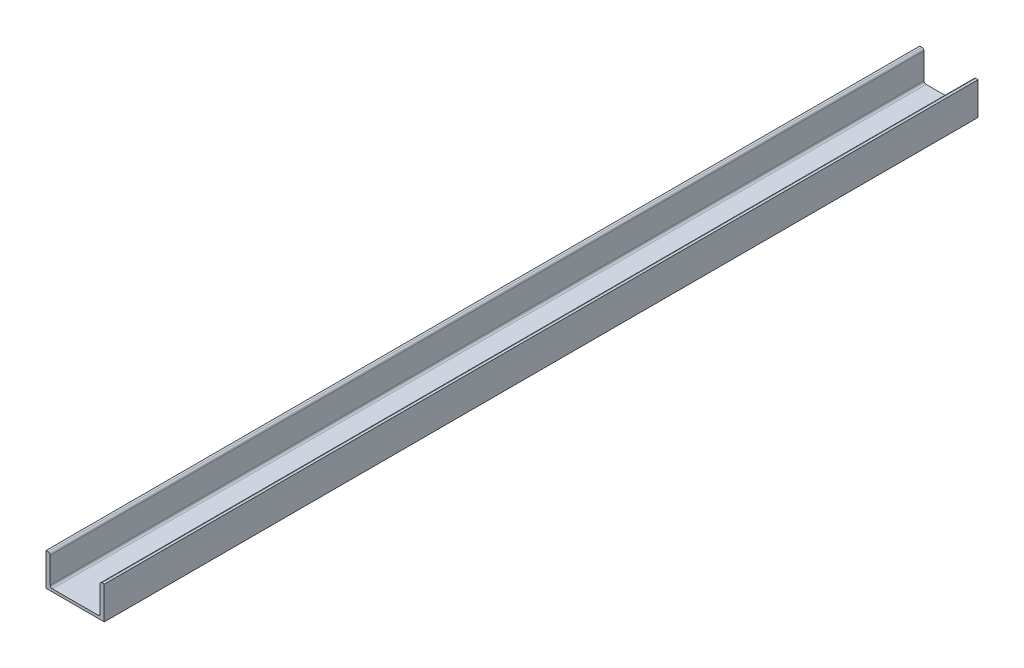
ISO-10303-21;
HEADER;
FILE_DESCRIPTION(('STEP AP214'),'2;1');
FILE_NAME('part.step','',(''),(''),'','','');
FILE_SCHEMA(('AUTOMOTIVE_DESIGN { 1 0 10303 214 1 1 1 1 }'));
ENDSEC;
DATA;
#1=APPLICATION_CONTEXT('core data for automotive mechanical design processes');
#2=APPLICATION_PROTOCOL_DEFINITION('international standard','automotive_design',2000,#1);
#3=PRODUCT_CONTEXT('',#1,'mechanical');
#4=PRODUCT('Part','Part','',(#3));
#5=PRODUCT_RELATED_PRODUCT_CATEGORY('part','',(#4));
#6=PRODUCT_DEFINITION_FORMATION('','',#4);
#7=PRODUCT_DEFINITION_CONTEXT('part definition',#1,'design');
#8=PRODUCT_DEFINITION('design','',#6,#7);
#9=PRODUCT_DEFINITION_SHAPE('','',#8);
#10=(LENGTH_UNIT() NAMED_UNIT(*) SI_UNIT(.MILLI.,.METRE.));
#11=(NAMED_UNIT(*) PLANE_ANGLE_UNIT() SI_UNIT($,.RADIAN.));
#12=(NAMED_UNIT(*) SI_UNIT($,.STERADIAN.) SOLID_ANGLE_UNIT());
#13=UNCERTAINTY_MEASURE_WITH_UNIT(LENGTH_MEASURE(1.E-05),#10,'distance_accuracy_value','');
#14=(GEOMETRIC_REPRESENTATION_CONTEXT(3) GLOBAL_UNCERTAINTY_ASSIGNED_CONTEXT((#13)) GLOBAL_UNIT_ASSIGNED_CONTEXT((#10,
#11,#12)) REPRESENTATION_CONTEXT('',''));
#15=CARTESIAN_POINT('',(0.,0.,0.));
#16=DIRECTION('',(0.,0.,1.));
#17=DIRECTION('',(1.,0.,0.));
#18=AXIS2_PLACEMENT_3D('',#15,#16,#17);
#19=CARTESIAN_POINT('',(-43.434,28.575,762.));
#20=DIRECTION('',(0.,-1.,0.));
#21=DIRECTION('',(0.,0.,-1.));
#22=AXIS2_PLACEMENT_3D('',#19,#20,#21);
#23=PLANE('',#22);
#24=DIRECTION('',(-1.,0.,0.));
#25=VECTOR('',#24,1.);
#26=CARTESIAN_POINT('',(-43.434,28.575,762.));
#27=LINE('',#26,#25);
#28=CARTESIAN_POINT('',(-47.117,28.575,762.));
#29=VERTEX_POINT('',#28);
#30=CARTESIAN_POINT('',(-50.8,28.575,762.));
#31=VERTEX_POINT('',#30);
#32=EDGE_CURVE('E120',#29,#31,#27,.T.);
#33=ORIENTED_EDGE('',*,*,#32,.F.);
#34=DIRECTION('',(0.,0.,-1.));
#35=VECTOR('',#34,1.);
#36=CARTESIAN_POINT('',(-47.117,28.575,762.));
#37=LINE('',#36,#35);
#38=CARTESIAN_POINT('',(-47.117,28.575,-762.));
#39=VERTEX_POINT('',#38);
#40=EDGE_CURVE('E146',#29,#39,#37,.T.);
#41=ORIENTED_EDGE('',*,*,#40,.T.);
#42=DIRECTION('',(-1.,0.,0.));
#43=VECTOR('',#42,1.);
#44=CARTESIAN_POINT('',(-43.434,28.575,-762.));
#45=LINE('',#44,#43);
#46=CARTESIAN_POINT('',(-50.8,28.575,-762.));
#47=VERTEX_POINT('',#46);
#48=EDGE_CURVE('E144',#39,#47,#45,.T.);
#49=ORIENTED_EDGE('',*,*,#48,.T.);
#50=DIRECTION('',(0.,0.,-1.));
#51=VECTOR('',#50,1.);
#52=CARTESIAN_POINT('',(-50.8,28.575,762.));
#53=LINE('',#52,#51);
#54=EDGE_CURVE('E137',#31,#47,#53,.T.);
#55=ORIENTED_EDGE('',*,*,#54,.F.);
#56=EDGE_LOOP('',(#33,#41,#49,#55));
#57=FACE_BOUND('',#56,.T.);
#58=ADVANCED_FACE('F32',(#57),#23,.F.);
#59=CARTESIAN_POINT('',(-50.8,28.575,762.));
#60=DIRECTION('',(1.,0.,0.));
#61=DIRECTION('',(0.,0.,-1.));
#62=AXIS2_PLACEMENT_3D('',#59,#60,#61);
#63=PLANE('',#62);
#64=DIRECTION('',(0.,-1.,0.));
#65=VECTOR('',#64,1.);
#66=CARTESIAN_POINT('',(-50.8,28.575,-762.));
#67=LINE('',#66,#65);
#68=CARTESIAN_POINT('',(-50.8,-28.575,-762.));
#69=VERTEX_POINT('',#68);
#70=EDGE_CURVE('E206',#47,#69,#67,.T.);
#71=ORIENTED_EDGE('',*,*,#70,.T.);
#72=DIRECTION('',(0.,0.,-1.));
#73=VECTOR('',#72,1.);
#74=CARTESIAN_POINT('',(-50.8,-28.575,762.));
#75=LINE('',#74,#73);
#76=CARTESIAN_POINT('',(-50.8,-28.575,762.));
#77=VERTEX_POINT('',#76);
#78=EDGE_CURVE('E139',#77,#69,#75,.T.);
#79=ORIENTED_EDGE('',*,*,#78,.F.);
#80=DIRECTION('',(0.,-1.,0.));
#81=VECTOR('',#80,1.);
#82=CARTESIAN_POINT('',(-50.8,28.575,762.));
#83=LINE('',#82,#81);
#84=EDGE_CURVE('E124',#31,#77,#83,.T.);
#85=ORIENTED_EDGE('',*,*,#84,.F.);
#86=ORIENTED_EDGE('',*,*,#54,.T.);
#87=EDGE_LOOP('',(#71,#79,#85,#86));
#88=FACE_BOUND('',#87,.T.);
#89=ADVANCED_FACE('F136',(#88),#63,.F.);
#90=CARTESIAN_POINT('',(-50.8,-28.575,762.));
#91=DIRECTION('',(0.,1.,0.));
#92=DIRECTION('',(-1.,0.,0.));
#93=AXIS2_PLACEMENT_3D('',#90,#91,#92);
#94=PLANE('',#93);
#95=DIRECTION('',(1.,0.,0.));
#96=VECTOR('',#95,1.);
#97=CARTESIAN_POINT('',(-50.8,-28.575,-762.));
#98=LINE('',#97,#96);
#99=CARTESIAN_POINT('',(50.8,-28.575,-762.));
#100=VERTEX_POINT('',#99);
#101=EDGE_CURVE('E208',#69,#100,#98,.T.);
#102=ORIENTED_EDGE('',*,*,#101,.T.);
#103=DIRECTION('',(0.,0.,-1.));
#104=VECTOR('',#103,1.);
#105=CARTESIAN_POINT('',(50.8,-28.575,762.));
#106=LINE('',#105,#104);
#107=CARTESIAN_POINT('',(50.8,-28.575,762.));
#108=VERTEX_POINT('',#107);
#109=EDGE_CURVE('E150',#108,#100,#106,.T.);
#110=ORIENTED_EDGE('',*,*,#109,.F.);
#111=DIRECTION('',(1.,0.,0.));
#112=VECTOR('',#111,1.);
#113=CARTESIAN_POINT('',(-50.8,-28.575,762.));
#114=LINE('',#113,#112);
#115=EDGE_CURVE('E141',#77,#108,#114,.T.);
#116=ORIENTED_EDGE('',*,*,#115,.F.);
#117=ORIENTED_EDGE('',*,*,#78,.T.);
#118=EDGE_LOOP('',(#102,#110,#116,#117));
#119=FACE_BOUND('',#118,.T.);
#120=ADVANCED_FACE('F246',(#119),#94,.F.);
#121=CARTESIAN_POINT('',(50.8,-28.575,762.));
#122=DIRECTION('',(-1.,0.,0.));
#123=DIRECTION('',(0.,-1.,0.));
#124=AXIS2_PLACEMENT_3D('',#121,#122,#123);
#125=PLANE('',#124);
#126=DIRECTION('',(0.,1.,0.));
#127=VECTOR('',#126,1.);
#128=CARTESIAN_POINT('',(50.8,-28.575,-762.));
#129=LINE('',#128,#127);
#130=CARTESIAN_POINT('',(50.8,28.575,-762.));
#131=VERTEX_POINT('',#130);
#132=EDGE_CURVE('E210',#100,#131,#129,.T.);
#133=ORIENTED_EDGE('',*,*,#132,.T.);
#134=DIRECTION('',(0.,0.,-1.));
#135=VECTOR('',#134,1.);
#136=CARTESIAN_POINT('',(50.8,28.575,762.));
#137=LINE('',#136,#135);
#138=CARTESIAN_POINT('',(50.8,28.575,762.));
#139=VERTEX_POINT('',#138);
#140=EDGE_CURVE('E197',#139,#131,#137,.T.);
#141=ORIENTED_EDGE('',*,*,#140,.F.);
#142=DIRECTION('',(0.,1.,0.));
#143=VECTOR('',#142,1.);
#144=CARTESIAN_POINT('',(50.8,-28.575,762.));
#145=LINE('',#144,#143);
#146=EDGE_CURVE('E224',#108,#139,#145,.T.);
#147=ORIENTED_EDGE('',*,*,#146,.F.);
#148=ORIENTED_EDGE('',*,*,#109,.T.);
#149=EDGE_LOOP('',(#133,#141,#147,#148));
#150=FACE_BOUND('',#149,.T.);
#151=ADVANCED_FACE('F222',(#150),#125,.F.);
#152=CARTESIAN_POINT('',(50.8,28.575,762.));
#153=DIRECTION('',(0.,-1.,0.));
#154=DIRECTION('',(1.,0.,0.));
#155=AXIS2_PLACEMENT_3D('',#152,#153,#154);
#156=PLANE('',#155);
#157=DIRECTION('',(-1.,0.,0.));
#158=VECTOR('',#157,1.);
#159=CARTESIAN_POINT('',(50.8,28.575,-762.));
#160=LINE('',#159,#158);
#161=CARTESIAN_POINT('',(47.117,28.575,-762.));
#162=VERTEX_POINT('',#161);
#163=EDGE_CURVE('E212',#131,#162,#160,.T.);
#164=ORIENTED_EDGE('',*,*,#163,.T.);
#165=DIRECTION('',(0.,0.,-1.));
#166=VECTOR('',#165,1.);
#167=CARTESIAN_POINT('',(47.117,28.575,762.));
#168=LINE('',#167,#166);
#169=CARTESIAN_POINT('',(47.117,28.575,762.));
#170=VERTEX_POINT('',#169);
#171=EDGE_CURVE('E170',#162,#170,#168,.F.);
#172=ORIENTED_EDGE('',*,*,#171,.T.);
#173=DIRECTION('',(-1.,0.,0.));
#174=VECTOR('',#173,1.);
#175=CARTESIAN_POINT('',(50.8,28.575,762.));
#176=LINE('',#175,#174);
#177=EDGE_CURVE('E239',#139,#170,#176,.T.);
#178=ORIENTED_EDGE('',*,*,#177,.F.);
#179=ORIENTED_EDGE('',*,*,#140,.T.);
#180=EDGE_LOOP('',(#164,#172,#178,#179));
#181=FACE_BOUND('',#180,.T.);
#182=ADVANCED_FACE('F231',(#181),#156,.F.);
#183=CARTESIAN_POINT('',(43.434,28.575,762.));
#184=DIRECTION('',(1.,0.,0.));
#185=DIRECTION('',(0.,1.,0.));
#186=AXIS2_PLACEMENT_3D('',#183,#184,#185);
#187=PLANE('',#186);
#188=DIRECTION('',(0.,-1.,0.));
#189=VECTOR('',#188,1.);
#190=CARTESIAN_POINT('',(43.434,28.575,762.));
#191=LINE('',#190,#189);
#192=CARTESIAN_POINT('',(43.434,24.892,762.));
#193=VERTEX_POINT('',#192);
#194=CARTESIAN_POINT('',(43.434,-20.066,762.));
#195=VERTEX_POINT('',#194);
#196=EDGE_CURVE('E201',#193,#195,#191,.T.);
#197=ORIENTED_EDGE('',*,*,#196,.F.);
#198=DIRECTION('',(0.,0.,-1.));
#199=VECTOR('',#198,1.);
#200=CARTESIAN_POINT('',(43.434,24.892,762.));
#201=LINE('',#200,#199);
#202=CARTESIAN_POINT('',(43.434,24.892,-762.));
#203=VERTEX_POINT('',#202);
#204=EDGE_CURVE('E167',#193,#203,#201,.T.);
#205=ORIENTED_EDGE('',*,*,#204,.T.);
#206=DIRECTION('',(0.,-1.,0.));
#207=VECTOR('',#206,1.);
#208=CARTESIAN_POINT('',(43.434,28.575,-762.));
#209=LINE('',#208,#207);
#210=CARTESIAN_POINT('',(43.434,-20.066,-762.));
#211=VERTEX_POINT('',#210);
#212=EDGE_CURVE('E188',#203,#211,#209,.T.);
#213=ORIENTED_EDGE('',*,*,#212,.T.);
#214=DIRECTION('',(0.,0.,-1.));
#215=VECTOR('',#214,1.);
#216=CARTESIAN_POINT('',(43.434,-20.066,762.));
#217=LINE('',#216,#215);
#218=EDGE_CURVE('E165',#211,#195,#217,.F.);
#219=ORIENTED_EDGE('',*,*,#218,.T.);
#220=EDGE_LOOP('',(#197,#205,#213,#219));
#221=FACE_BOUND('',#220,.T.);
#222=ADVANCED_FACE('F241',(#221),#187,.F.);
#223=CARTESIAN_POINT('',(43.434,-23.749,762.));
#224=DIRECTION('',(0.,-1.,0.));
#225=DIRECTION('',(1.,0.,0.));
#226=AXIS2_PLACEMENT_3D('',#223,#224,#225);
#227=PLANE('',#226);
#228=DIRECTION('',(-1.,0.,0.));
#229=VECTOR('',#228,1.);
#230=CARTESIAN_POINT('',(43.434,-23.749,762.));
#231=LINE('',#230,#229);
#232=CARTESIAN_POINT('',(39.751,-23.749,762.));
#233=VERTEX_POINT('',#232);
#234=CARTESIAN_POINT('',(-39.751,-23.749,762.));
#235=VERTEX_POINT('',#234);
#236=EDGE_CURVE('E193',#233,#235,#231,.T.);
#237=ORIENTED_EDGE('',*,*,#236,.F.);
#238=DIRECTION('',(0.,0.,-1.));
#239=VECTOR('',#238,1.);
#240=CARTESIAN_POINT('',(39.751,-23.749,-762.));
#241=LINE('',#240,#239);
#242=CARTESIAN_POINT('',(39.751,-23.749,-762.));
#243=VERTEX_POINT('',#242);
#244=EDGE_CURVE('E173',#233,#243,#241,.T.);
#245=ORIENTED_EDGE('',*,*,#244,.T.);
#246=DIRECTION('',(-1.,0.,0.));
#247=VECTOR('',#246,1.);
#248=CARTESIAN_POINT('',(43.434,-23.749,-762.));
#249=LINE('',#248,#247);
#250=CARTESIAN_POINT('',(-39.751,-23.749,-762.));
#251=VERTEX_POINT('',#250);
#252=EDGE_CURVE('E182',#243,#251,#249,.T.);
#253=ORIENTED_EDGE('',*,*,#252,.T.);
#254=DIRECTION('',(0.,0.,-1.));
#255=VECTOR('',#254,1.);
#256=CARTESIAN_POINT('',(-39.751,-23.749,762.));
#257=LINE('',#256,#255);
#258=EDGE_CURVE('E47',#251,#235,#257,.F.);
#259=ORIENTED_EDGE('',*,*,#258,.T.);
#260=EDGE_LOOP('',(#237,#245,#253,#259));
#261=FACE_BOUND('',#260,.T.);
#262=ADVANCED_FACE('F186',(#261),#227,.F.);
#263=CARTESIAN_POINT('',(-43.434,-23.749,762.));
#264=DIRECTION('',(-1.,0.,0.));
#265=DIRECTION('',(0.,0.,1.));
#266=AXIS2_PLACEMENT_3D('',#263,#264,#265);
#267=PLANE('',#266);
#268=DIRECTION('',(0.,1.,0.));
#269=VECTOR('',#268,1.);
#270=CARTESIAN_POINT('',(-43.434,-23.749,-762.));
#271=LINE('',#270,#269);
#272=CARTESIAN_POINT('',(-43.434,-20.066,-762.));
#273=VERTEX_POINT('',#272);
#274=CARTESIAN_POINT('',(-43.434,24.892,-762.));
#275=VERTEX_POINT('',#274);
#276=EDGE_CURVE('E132',#273,#275,#271,.T.);
#277=ORIENTED_EDGE('',*,*,#276,.T.);
#278=DIRECTION('',(0.,0.,-1.));
#279=VECTOR('',#278,1.);
#280=CARTESIAN_POINT('',(-43.434,24.892,762.));
#281=LINE('',#280,#279);
#282=CARTESIAN_POINT('',(-43.434,24.892,762.));
#283=VERTEX_POINT('',#282);
#284=EDGE_CURVE('E160',#275,#283,#281,.F.);
#285=ORIENTED_EDGE('',*,*,#284,.T.);
#286=DIRECTION('',(0.,1.,0.));
#287=VECTOR('',#286,1.);
#288=CARTESIAN_POINT('',(-43.434,-23.749,762.));
#289=LINE('',#288,#287);
#290=CARTESIAN_POINT('',(-43.434,-20.066,762.));
#291=VERTEX_POINT('',#290);
#292=EDGE_CURVE('E192',#291,#283,#289,.T.);
#293=ORIENTED_EDGE('',*,*,#292,.F.);
#294=DIRECTION('',(0.,0.,-1.));
#295=VECTOR('',#294,1.);
#296=CARTESIAN_POINT('',(-43.434,-20.066,-762.));
#297=LINE('',#296,#295);
#298=EDGE_CURVE('E157',#291,#273,#297,.T.);
#299=ORIENTED_EDGE('',*,*,#298,.T.);
#300=EDGE_LOOP('',(#277,#285,#293,#299));
#301=FACE_BOUND('',#300,.T.);
#302=ADVANCED_FACE('F195',(#301),#267,.F.);
#303=CARTESIAN_POINT('',(0.,0.,762.));
#304=DIRECTION('',(0.,0.,1.));
#305=DIRECTION('',(1.,0.,0.));
#306=AXIS2_PLACEMENT_3D('',#303,#304,#305);
#307=PLANE('',#306);
#308=ORIENTED_EDGE('',*,*,#292,.T.);
#309=CARTESIAN_POINT('',(-47.117,24.892,762.));
#310=DIRECTION('',(0.,0.,1.));
#311=DIRECTION('',(1.,0.,0.));
#312=AXIS2_PLACEMENT_3D('',#309,#310,#311);
#313=CIRCLE('',#312,3.683);
#314=EDGE_CURVE('E127',#283,#29,#313,.T.);
#315=ORIENTED_EDGE('',*,*,#314,.T.);
#316=ORIENTED_EDGE('',*,*,#32,.T.);
#317=ORIENTED_EDGE('',*,*,#84,.T.);
#318=ORIENTED_EDGE('',*,*,#115,.T.);
#319=ORIENTED_EDGE('',*,*,#146,.T.);
#320=ORIENTED_EDGE('',*,*,#177,.T.);
#321=CARTESIAN_POINT('',(47.117,24.892,762.));
#322=DIRECTION('',(0.,0.,1.));
#323=DIRECTION('',(1.,0.,0.));
#324=AXIS2_PLACEMENT_3D('',#321,#322,#323);
#325=CIRCLE('',#324,3.683);
#326=EDGE_CURVE('E162',#170,#193,#325,.T.);
#327=ORIENTED_EDGE('',*,*,#326,.T.);
#328=ORIENTED_EDGE('',*,*,#196,.T.);
#329=CARTESIAN_POINT('',(39.751,-20.066,762.));
#330=DIRECTION('',(0.,0.,1.));
#331=DIRECTION('',(1.,0.,0.));
#332=AXIS2_PLACEMENT_3D('',#329,#330,#331);
#333=CIRCLE('',#332,3.683);
#334=EDGE_CURVE('E54',#195,#233,#333,.F.);
#335=ORIENTED_EDGE('',*,*,#334,.T.);
#336=ORIENTED_EDGE('',*,*,#236,.T.);
#337=CARTESIAN_POINT('',(-39.751,-20.066,762.));
#338=DIRECTION('',(0.,0.,1.));
#339=DIRECTION('',(1.,0.,0.));
#340=AXIS2_PLACEMENT_3D('',#337,#338,#339);
#341=CIRCLE('',#340,3.683);
#342=EDGE_CURVE('E11',#235,#291,#341,.F.);
#343=ORIENTED_EDGE('',*,*,#342,.T.);
#344=EDGE_LOOP('',(#308,#315,#316,#317,#318,#319,#320,#327,#328,#335,#336,#343));
#345=FACE_BOUND('',#344,.T.);
#346=ADVANCED_FACE('F123',(#345),#307,.T.);
#347=CARTESIAN_POINT('',(0.,0.,-762.));
#348=DIRECTION('',(0.,0.,1.));
#349=DIRECTION('',(1.,0.,0.));
#350=AXIS2_PLACEMENT_3D('',#347,#348,#349);
#351=PLANE('',#350);
#352=ORIENTED_EDGE('',*,*,#48,.F.);
#353=CARTESIAN_POINT('',(-47.117,24.892,-762.));
#354=DIRECTION('',(0.,0.,1.));
#355=DIRECTION('',(1.,0.,0.));
#356=AXIS2_PLACEMENT_3D('',#353,#354,#355);
#357=CIRCLE('',#356,3.683);
#358=EDGE_CURVE('E155',#39,#275,#357,.F.);
#359=ORIENTED_EDGE('',*,*,#358,.T.);
#360=ORIENTED_EDGE('',*,*,#276,.F.);
#361=CARTESIAN_POINT('',(-39.751,-20.066,-762.));
#362=DIRECTION('',(0.,0.,1.));
#363=DIRECTION('',(1.,0.,0.));
#364=AXIS2_PLACEMENT_3D('',#361,#362,#363);
#365=CIRCLE('',#364,3.683);
#366=EDGE_CURVE('E40',#273,#251,#365,.T.);
#367=ORIENTED_EDGE('',*,*,#366,.T.);
#368=ORIENTED_EDGE('',*,*,#252,.F.);
#369=CARTESIAN_POINT('',(39.751,-20.066,-762.));
#370=DIRECTION('',(0.,0.,1.));
#371=DIRECTION('',(1.,0.,0.));
#372=AXIS2_PLACEMENT_3D('',#369,#370,#371);
#373=CIRCLE('',#372,3.683);
#374=EDGE_CURVE('E176',#243,#211,#373,.T.);
#375=ORIENTED_EDGE('',*,*,#374,.T.);
#376=ORIENTED_EDGE('',*,*,#212,.F.);
#377=CARTESIAN_POINT('',(47.117,24.892,-762.));
#378=DIRECTION('',(0.,0.,1.));
#379=DIRECTION('',(1.,0.,0.));
#380=AXIS2_PLACEMENT_3D('',#377,#378,#379);
#381=CIRCLE('',#380,3.683);
#382=EDGE_CURVE('E148',#203,#162,#381,.F.);
#383=ORIENTED_EDGE('',*,*,#382,.T.);
#384=ORIENTED_EDGE('',*,*,#163,.F.);
#385=ORIENTED_EDGE('',*,*,#132,.F.);
#386=ORIENTED_EDGE('',*,*,#101,.F.);
#387=ORIENTED_EDGE('',*,*,#70,.F.);
#388=EDGE_LOOP('',(#352,#359,#360,#367,#368,#375,#376,#383,#384,#385,#386,#387));
#389=FACE_BOUND('',#388,.T.);
#390=ADVANCED_FACE('F181',(#389),#351,.F.);
#391=CARTESIAN_POINT('',(-47.117,24.892,762.));
#392=DIRECTION('',(0.,0.,-1.));
#393=DIRECTION('',(-1.,0.,0.));
#394=AXIS2_PLACEMENT_3D('',#391,#392,#393);
#395=CYLINDRICAL_SURFACE('',#394,3.683);
#396=ORIENTED_EDGE('',*,*,#314,.F.);
#397=ORIENTED_EDGE('',*,*,#284,.F.);
#398=ORIENTED_EDGE('',*,*,#358,.F.);
#399=ORIENTED_EDGE('',*,*,#40,.F.);
#400=EDGE_LOOP('',(#396,#397,#398,#399));
#401=FACE_BOUND('',#400,.T.);
#402=ADVANCED_FACE('F260',(#401),#395,.T.);
#403=CARTESIAN_POINT('',(47.117,24.892,762.));
#404=DIRECTION('',(0.,0.,-1.));
#405=DIRECTION('',(-1.,0.,0.));
#406=AXIS2_PLACEMENT_3D('',#403,#404,#405);
#407=CYLINDRICAL_SURFACE('',#406,3.683);
#408=ORIENTED_EDGE('',*,*,#326,.F.);
#409=ORIENTED_EDGE('',*,*,#171,.F.);
#410=ORIENTED_EDGE('',*,*,#382,.F.);
#411=ORIENTED_EDGE('',*,*,#204,.F.);
#412=EDGE_LOOP('',(#408,#409,#410,#411));
#413=FACE_BOUND('',#412,.T.);
#414=ADVANCED_FACE('F236',(#413),#407,.T.);
#415=CARTESIAN_POINT('',(39.751,-20.066,762.));
#416=DIRECTION('',(0.,0.,1.));
#417=DIRECTION('',(1.,0.,0.));
#418=AXIS2_PLACEMENT_3D('',#415,#416,#417);
#419=CYLINDRICAL_SURFACE('',#418,3.683);
#420=ORIENTED_EDGE('',*,*,#334,.F.);
#421=ORIENTED_EDGE('',*,*,#218,.F.);
#422=ORIENTED_EDGE('',*,*,#374,.F.);
#423=ORIENTED_EDGE('',*,*,#244,.F.);
#424=EDGE_LOOP('',(#420,#421,#422,#423));
#425=FACE_BOUND('',#424,.T.);
#426=ADVANCED_FACE('F265',(#425),#419,.F.);
#427=CARTESIAN_POINT('',(-39.751,-20.066,762.));
#428=DIRECTION('',(0.,0.,1.));
#429=DIRECTION('',(1.,0.,0.));
#430=AXIS2_PLACEMENT_3D('',#427,#428,#429);
#431=CYLINDRICAL_SURFACE('',#430,3.683);
#432=ORIENTED_EDGE('',*,*,#342,.F.);
#433=ORIENTED_EDGE('',*,*,#258,.F.);
#434=ORIENTED_EDGE('',*,*,#366,.F.);
#435=ORIENTED_EDGE('',*,*,#298,.F.);
#436=EDGE_LOOP('',(#432,#433,#434,#435));
#437=FACE_BOUND('',#436,.T.);
#438=ADVANCED_FACE('F34',(#437),#431,.F.);
#439=CLOSED_SHELL('',(#58,#89,#120,#151,#182,#222,#262,#302,#346,#390,#402,#414,#426,#438));
#440=MANIFOLD_SOLID_BREP('B2',#439);
#441=ADVANCED_BREP_SHAPE_REPRESENTATION('',(#18,#440),#14);
#442=SHAPE_DEFINITION_REPRESENTATION(#9,#441);
ENDSEC;
END-ISO-10303-21;
